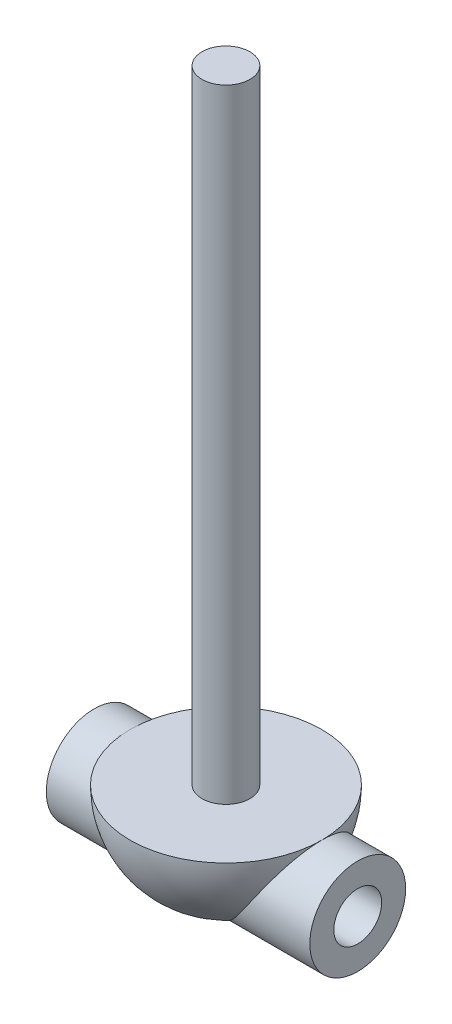
ISO-10303-21;
HEADER;
FILE_DESCRIPTION(('STEP AP214'),'2;1');
FILE_NAME('part.step','',(''),(''),'','','');
FILE_SCHEMA(('AUTOMOTIVE_DESIGN { 1 0 10303 214 1 1 1 1 }'));
ENDSEC;
DATA;
#1=APPLICATION_CONTEXT('core data for automotive mechanical design processes');
#2=APPLICATION_PROTOCOL_DEFINITION('international standard','automotive_design',2000,#1);
#3=PRODUCT_CONTEXT('',#1,'mechanical');
#4=PRODUCT('Part','Part','',(#3));
#5=PRODUCT_RELATED_PRODUCT_CATEGORY('part','',(#4));
#6=PRODUCT_DEFINITION_FORMATION('','',#4);
#7=PRODUCT_DEFINITION_CONTEXT('part definition',#1,'design');
#8=PRODUCT_DEFINITION('design','',#6,#7);
#9=PRODUCT_DEFINITION_SHAPE('','',#8);
#10=(LENGTH_UNIT() NAMED_UNIT(*) SI_UNIT(.MILLI.,.METRE.));
#11=(NAMED_UNIT(*) PLANE_ANGLE_UNIT() SI_UNIT($,.RADIAN.));
#12=(NAMED_UNIT(*) SI_UNIT($,.STERADIAN.) SOLID_ANGLE_UNIT());
#13=UNCERTAINTY_MEASURE_WITH_UNIT(LENGTH_MEASURE(1.E-05),#10,'distance_accuracy_value','');
#14=(GEOMETRIC_REPRESENTATION_CONTEXT(3) GLOBAL_UNCERTAINTY_ASSIGNED_CONTEXT((#13)) GLOBAL_UNIT_ASSIGNED_CONTEXT((#10,
#11,#12)) REPRESENTATION_CONTEXT('',''));
#15=CARTESIAN_POINT('',(0.,0.,0.));
#16=DIRECTION('',(0.,0.,1.));
#17=DIRECTION('',(1.,0.,0.));
#18=AXIS2_PLACEMENT_3D('',#15,#16,#17);
#19=CARTESIAN_POINT('',(0.,0.,0.));
#20=DIRECTION('',(0.,0.,1.));
#21=DIRECTION('',(-1.,0.,0.));
#22=AXIS2_PLACEMENT_3D('',#19,#20,#21);
#23=SPHERICAL_SURFACE('',#22,20.);
#24=CARTESIAN_POINT('',(0.,-20.,0.));
#25=CARTESIAN_POINT('',(4.14831613541327E-07,-19.9999999999998,-0.00102883859797912));
#26=CARTESIAN_POINT('',(0.00172323426402062,-19.9999998412064,-0.00205767717692917));
#27=CARTESIAN_POINT('',(0.00513064306400289,-19.9999990476308,-0.00462918097390953));
#28=CARTESIAN_POINT('',(0.00636643381856822,-19.9999982147365,-0.00617184835853093));
#29=CARTESIAN_POINT('',(0.0112930382150983,-19.9999938658802,-0.0118096893898919));
#30=CARTESIAN_POINT('',(0.0156626842264328,-19.9999881907312,-0.0159048421317701));
#31=CARTESIAN_POINT('',(0.0761590890814044,-19.9998739473029,-0.0730235194752118));
#32=CARTESIAN_POINT('',(0.126898929620371,-19.9993461620011,-0.126047065050154));
#33=CARTESIAN_POINT('',(0.230252165779001,-19.9974652291537,-0.231073636150307));
#34=CARTESIAN_POINT('',(0.282811694101503,-19.996127943494,-0.283076922430578));
#35=CARTESIAN_POINT('',(0.438698539962355,-19.9909328976958,-0.438033067555782));
#36=CARTESIAN_POINT('',(0.541279635916295,-19.9858894413477,-0.540952565935052));
#37=CARTESIAN_POINT('',(0.745681742284529,-19.972703981077,-0.745340640505116));
#38=CARTESIAN_POINT('',(0.847496485745131,-19.9646010281458,-0.846811433070955));
#39=CARTESIAN_POINT('',(1.05148686631379,-19.945245555244,-1.05003049918738));
#40=CARTESIAN_POINT('',(1.15366156769133,-19.9339766193805,-1.15177740586295));
#41=CARTESIAN_POINT('',(1.36433843111238,-19.9075161957602,-1.36122938944828));
#42=CARTESIAN_POINT('',(1.47283984106687,-19.8921247101919,-1.4689124480024));
#43=CARTESIAN_POINT('',(1.68960340953795,-19.8578491067159,-1.68363164382968));
#44=CARTESIAN_POINT('',(1.79786568815271,-19.8389700225273,-1.79066848674435));
#45=CARTESIAN_POINT('',(2.12382771400155,-19.7768373741828,-2.11217588727407));
#46=CARTESIAN_POINT('',(2.34141563507168,-19.7282500191868,-2.3257617832242));
#47=CARTESIAN_POINT('',(2.74310260592925,-19.6254689815266,-2.71751747005978));
#48=CARTESIAN_POINT('',(2.92726997472451,-19.5732467999649,-2.8961404849352));
#49=CARTESIAN_POINT('',(3.29494880556522,-19.4588530380295,-3.25033621520936));
#50=CARTESIAN_POINT('',(3.47846081897585,-19.3966950833429,-3.42591274810426));
#51=CARTESIAN_POINT('',(3.84260956001678,-19.263353274503,-3.77148965130733));
#52=CARTESIAN_POINT('',(4.0232525542533,-19.1922978124485,-3.94153289113636));
#53=CARTESIAN_POINT('',(4.38404486639263,-19.0406359407747,-4.27796385773468));
#54=CARTESIAN_POINT('',(4.56419397658952,-18.9600260022541,-4.4443502067829));
#55=CARTESIAN_POINT('',(5.12468636508459,-18.6941196099947,-4.95638246947543));
#56=CARTESIAN_POINT('',(5.50402128749026,-18.4924104741254,-5.29480069822149));
#57=CARTESIAN_POINT('',(6.26048195291774,-18.0475011756731,-5.94936780386797));
#58=CARTESIAN_POINT('',(6.63759383469815,-17.8041463480572,-6.26542722529558));
#59=CARTESIAN_POINT('',(7.40211566169654,-17.2680229454137,-6.88105358766624));
#60=CARTESIAN_POINT('',(7.78934722257092,-16.9736872481882,-7.17948282927069));
#61=CARTESIAN_POINT('',(8.557500662027,-16.3458268620981,-7.73998579661725));
#62=CARTESIAN_POINT('',(8.93842871655474,-16.0123434847459,-8.00209722172861));
#63=CARTESIAN_POINT('',(9.66551168278303,-15.3350105667996,-8.4672236002892));
#64=CARTESIAN_POINT('',(10.0121703096655,-14.9937083336209,-8.67316052656643));
#65=CARTESIAN_POINT('',(10.698396654239,-14.2831020671018,-9.04521380020614));
#66=CARTESIAN_POINT('',(11.0379625478574,-13.9137909409623,-9.21132001646749));
#67=CARTESIAN_POINT('',(11.7050677847445,-13.1550736517584,-9.49780000008189));
#68=CARTESIAN_POINT('',(12.0326968071013,-12.7659240362104,-9.61864295405974));
#69=CARTESIAN_POINT('',(12.6782420401307,-11.9683134980974,-9.81295489726059));
#70=CARTESIAN_POINT('',(12.9961620289596,-11.5598602490969,-9.88644254391011));
#71=CARTESIAN_POINT('',(13.5396958843185,-10.8365088823579,-9.96976923166016));
#72=CARTESIAN_POINT('',(13.7678645247057,-10.5248220191166,-9.99117284532529));
#73=CARTESIAN_POINT('',(14.21731629355,-9.89591934545801,-10.0044010829142));
#74=CARTESIAN_POINT('',(14.4386006347581,-9.57870452439355,-9.99623094670561));
#75=CARTESIAN_POINT('',(14.873907289693,-8.94071745974626,-9.94889099093629));
#76=CARTESIAN_POINT('',(15.0879153687065,-8.61993970803877,-9.90966368661991));
#77=CARTESIAN_POINT('',(15.5073583817711,-7.97829089533959,-9.79891223788607));
#78=CARTESIAN_POINT('',(15.7127930106541,-7.65741983143515,-9.72738694490586));
#79=CARTESIAN_POINT('',(16.1154237956081,-7.01669558604578,-9.55044898452555));
#80=CARTESIAN_POINT('',(16.3125564344658,-6.69686319313917,-9.44481519098688));
#81=CARTESIAN_POINT('',(16.6959957078322,-6.06402394431193,-9.19909118540763));
#82=CARTESIAN_POINT('',(16.8823038560355,-5.75101613788554,-9.05900580547618));
#83=CARTESIAN_POINT('',(17.2427727987653,-5.13596244506607,-8.74416359576804));
#84=CARTESIAN_POINT('',(17.4169431249849,-4.8339080485758,-8.56943439565502));
#85=CARTESIAN_POINT('',(17.751979575717,-4.24476385376487,-8.18540349096924));
#86=CARTESIAN_POINT('',(17.9128483837187,-3.95767104139061,-7.97610878541074));
#87=CARTESIAN_POINT('',(18.1992072651267,-3.44032550196901,-7.55424298432744));
#88=CARTESIAN_POINT('',(18.3265432510105,-3.20762747398298,-7.34591655451177));
#89=CARTESIAN_POINT('',(18.5693085923796,-2.75977544584315,-6.90491567392721));
#90=CARTESIAN_POINT('',(18.6847403384434,-2.54461792507544,-6.67224613065913));
#91=CARTESIAN_POINT('',(18.9026971200884,-2.1349957074141,-6.18410489135198));
#92=CARTESIAN_POINT('',(19.005232116636,-1.94051505866682,-5.92865105695341));
#93=CARTESIAN_POINT('',(19.196574043518,-1.57503509462071,-5.39667071627836));
#94=CARTESIAN_POINT('',(19.2853832250899,-1.40403192918063,-5.12014767679603));
#95=CARTESIAN_POINT('',(19.4368267389484,-1.11073281469695,-4.58905855133343));
#96=CARTESIAN_POINT('',(19.5013871404702,-0.984968550420588,-4.33694973472204));
#97=CARTESIAN_POINT('',(19.6192659232045,-0.754394047225822,-3.820814767167));
#98=CARTESIAN_POINT('',(19.6725858880424,-0.649580856692405,-3.55679030134915));
#99=CARTESIAN_POINT('',(19.7675213823416,-0.462367605790171,-3.01903733735542));
#100=CARTESIAN_POINT('',(19.8091434370243,-0.379955050950195,-2.74531434546647));
#101=CARTESIAN_POINT('',(19.8803600087888,-0.238627855087312,-2.19033874532173));
#102=CARTESIAN_POINT('',(19.9099553388692,-0.17971162573321,-1.90908664739903));
#103=CARTESIAN_POINT('',(19.9546125785941,-0.0906941389667483,-1.36869640638369));
#104=CARTESIAN_POINT('',(19.9707928906749,-0.0583776357683751,-1.11001281455245));
#105=CARTESIAN_POINT('',(19.9929788385115,-0.0140460943366076,-0.590488290879405));
#106=CARTESIAN_POINT('',(19.9989852580754,-0.00202949217624818,-0.329647526784566));
#107=CARTESIAN_POINT('',(20.0007784039475,0.00155681761374513,0.192145669602204));
#108=CARTESIAN_POINT('',(19.9965675355559,-0.00686866238878316,0.453098061155324));
#109=CARTESIAN_POINT('',(19.97796341209,-0.0440532256627959,0.973184689005887));
#110=CARTESIAN_POINT('',(19.9635701954145,-0.0728122322542305,1.23231893215605));
#111=CARTESIAN_POINT('',(19.9253800246893,-0.148979040969017,1.73795698640303));
#112=CARTESIAN_POINT('',(19.9019234391477,-0.195711594742749,1.98458871143244));
#113=CARTESIAN_POINT('',(19.8457823893017,-0.307285439683508,2.47263860614405));
#114=CARTESIAN_POINT('',(19.8130982327125,-0.372126126991155,2.71405694938988));
#115=CARTESIAN_POINT('',(19.7387214767697,-0.519212814724229,3.19010027747987));
#116=CARTESIAN_POINT('',(19.6970288751781,-0.601458819473932,3.42472526063622));
#117=CARTESIAN_POINT('',(19.604904083296,-0.782492823763271,3.88572914240185));
#118=CARTESIAN_POINT('',(19.5544716627317,-0.881281259155388,4.1121078235499));
#119=CARTESIAN_POINT('',(19.4438513721776,-1.09698879535432,4.56068211506981));
#120=CARTESIAN_POINT('',(19.3834565137957,-1.21428961000836,4.78264300314599));
#121=CARTESIAN_POINT('',(19.2541933438638,-1.46401072696621,5.21529282301572));
#122=CARTESIAN_POINT('',(19.185324962152,-1.59643115446135,5.42598166145477));
#123=CARTESIAN_POINT('',(19.0395003265513,-1.87513713673495,5.83505493596763));
#124=CARTESIAN_POINT('',(18.9625431129618,-2.02142433653605,6.03343790755993));
#125=CARTESIAN_POINT('',(18.8009525696274,-2.32653550945153,6.41700943457038));
#126=CARTESIAN_POINT('',(18.7163184969837,-2.48536069568845,6.60219670992244));
#127=CARTESIAN_POINT('',(18.5333290095976,-2.82623435862028,6.97171483701254));
#128=CARTESIAN_POINT('',(18.4344226457843,-3.00913175580195,7.15498995212919));
#129=CARTESIAN_POINT('',(18.2287711201836,-3.38612381622127,7.50485073767034));
#130=CARTESIAN_POINT('',(18.1220256381662,-3.58021893681909,7.6714357256412));
#131=CARTESIAN_POINT('',(17.9011780112694,-3.97800103396177,7.98749494374025));
#132=CARTESIAN_POINT('',(17.787073990102,-4.18169045327297,8.13696478264886));
#133=CARTESIAN_POINT('',(17.5520223025774,-4.59701637726014,8.41847479493727));
#134=CARTESIAN_POINT('',(17.431074005478,-4.80865361376985,8.55051335816849));
#135=CARTESIAN_POINT('',(17.1691306283392,-5.2619970219893,8.81061460419411));
#136=CARTESIAN_POINT('',(17.0273950067467,-5.50444712836793,8.93663659964228));
#137=CARTESIAN_POINT('',(16.7366974619657,-5.99520436578143,9.16706675853604));
#138=CARTESIAN_POINT('',(16.5877350779776,-6.24351186978122,9.27147354149031));
#139=CARTESIAN_POINT('',(16.2831479815078,-6.7441143024559,9.45889253342769));
#140=CARTESIAN_POINT('',(16.1275224044337,-6.99640974589612,9.54190195609419));
#141=CARTESIAN_POINT('',(15.8101595948264,-7.50320196704659,9.68687150178481));
#142=CARTESIAN_POINT('',(15.6484217542897,-7.75769896179923,9.74882952461249));
#143=CARTESIAN_POINT('',(15.297405319394,-8.30120767505458,9.8590510526541));
#144=CARTESIAN_POINT('',(15.1073289022756,-8.59029923735044,9.90438920515326));
#145=CARTESIAN_POINT('',(14.720652853984,-9.16698837140469,9.96946902954632));
#146=CARTESIAN_POINT('',(14.5240527152856,-9.45458582490355,9.98920870514755));
#147=CARTESIAN_POINT('',(14.1247484051175,-10.0265690350494,10.004060157075));
#148=CARTESIAN_POINT('',(13.9220382760579,-10.3109512591101,9.99914706904551));
#149=CARTESIAN_POINT('',(13.5112535716389,-10.8744112009495,9.96569492486226));
#150=CARTESIAN_POINT('',(13.3031784562485,-11.1534883797802,9.93715348124994));
#151=CARTESIAN_POINT('',(12.8518368644128,-11.744413871287,9.85182751879243));
#152=CARTESIAN_POINT('',(12.6078197890246,-12.0551898353314,9.79156596301241));
#153=CARTESIAN_POINT('',(12.1141327748394,-12.6654367004932,9.64334296687269));
#154=CARTESIAN_POINT('',(11.8644623360037,-12.9649065952935,9.55537906729532));
#155=CARTESIAN_POINT('',(11.3607954623674,-13.5497784222024,9.35384830643039));
#156=CARTESIAN_POINT('',(11.1068128055058,-13.835216761902,9.2403524879252));
#157=CARTESIAN_POINT('',(10.5944040100122,-14.3912129563096,8.98945426076028));
#158=CARTESIAN_POINT('',(10.3359775302708,-14.6617696619446,8.85205000943174));
#159=CARTESIAN_POINT('',(9.78104862184817,-15.2208908188116,8.53572094219382));
#160=CARTESIAN_POINT('',(9.48399470238206,-15.507168403391,8.35371462881153));
#161=CARTESIAN_POINT('',(8.88548749705673,-16.0568846901373,7.96414908131655));
#162=CARTESIAN_POINT('',(8.58403349032049,-16.3203195997313,7.75658561773783));
#163=CARTESIAN_POINT('',(7.97319848041232,-16.8261325632142,7.31560122227494));
#164=CARTESIAN_POINT('',(7.66376545685834,-17.0681727309438,7.08186502695808));
#165=CARTESIAN_POINT('',(7.04169307282176,-17.5255645048355,6.59376415392885));
#166=CARTESIAN_POINT('',(6.72905461925026,-17.7409234459484,6.33940517759105));
#167=CARTESIAN_POINT('',(6.05761187393965,-18.1716523973079,5.77637047203211));
#168=CARTESIAN_POINT('',(5.69839241476785,-18.3829199271397,5.46504376871659));
#169=CARTESIAN_POINT('',(4.97654529951651,-18.7682226997751,4.82273086402325));
#170=CARTESIAN_POINT('',(4.61391352193555,-18.9422045485955,4.49171732521746));
#171=CARTESIAN_POINT('',(3.90511072542334,-19.2434597739524,3.83186223284448));
#172=CARTESIAN_POINT('',(3.55905134533433,-19.3726738463678,3.50378304829977));
#173=CARTESIAN_POINT('',(2.86718547090612,-19.5949132520109,2.83898001881138));
#174=CARTESIAN_POINT('',(2.52138692359514,-19.6881222761138,2.50230965282746));
#175=CARTESIAN_POINT('',(2.01080995881068,-19.7991835558276,2.00083856443555));
#176=CARTESIAN_POINT('',(1.84636520956727,-19.8309001374552,1.83865942020089));
#177=CARTESIAN_POINT('',(1.59843352810732,-19.8725983779515,1.59336295187363));
#178=CARTESIAN_POINT('',(1.51500789717401,-19.8855860389892,1.51069098012651));
#179=CARTESIAN_POINT('',(1.347999039417,-19.9094937429417,1.34497294286252));
#180=CARTESIAN_POINT('',(1.26441575164349,-19.9204109783494,1.26192652352417));
#181=CARTESIAN_POINT('',(1.08127582055366,-19.9420388619524,1.07972721655002));
#182=CARTESIAN_POINT('',(0.981718610240644,-19.9523114671108,0.98052872768434));
#183=CARTESIAN_POINT('',(0.782953698604524,-19.969836849711,0.782425246832267));
#184=CARTESIAN_POINT('',(0.683746918455959,-19.9771052484138,0.683521461099217));
#185=CARTESIAN_POINT('',(0.491735960534729,-19.9883510932146,0.491462805853133));
#186=CARTESIAN_POINT('',(0.398902647846471,-19.9924988892102,0.398316691874606));
#187=CARTESIAN_POINT('',(0.257838417294251,-19.9967800201044,0.258080858752206));
#188=CARTESIAN_POINT('',(0.210275495307926,-19.9978842001169,0.211016056901819));
#189=CARTESIAN_POINT('',(0.116733621107412,-19.99944268341,0.115967636790702));
#190=CARTESIAN_POINT('',(0.0708029825578258,-19.9998840274415,0.0679838234575748));
#191=CARTESIAN_POINT('',(0.0156668270458145,-19.9999881858514,0.0159072729241776));
#192=CARTESIAN_POINT('',(0.011298202683801,-19.9999938591253,0.0118145507396099));
#193=CARTESIAN_POINT('',(0.00637232755286715,-19.9999982114663,0.00617753731017496));
#194=CARTESIAN_POINT('',(0.00513566190497414,-19.9999990459854,0.00463326626110509));
#195=CARTESIAN_POINT('',(0.00172434489336341,-19.9999998409519,0.00205933151752605));
#196=CARTESIAN_POINT('',(-4.15165103230015E-07,-20.0000000000002,0.00102966574923318));
#197=CARTESIAN_POINT('',(0.,-20.,0.));
#198=B_SPLINE_CURVE_WITH_KNOTS('',3,(#24,#25,#26,#27,#28,#29,#30,#31,#32,#33,#34,#35,#36,#37,
#38,#39,#40,#41,#42,#43,#44,#45,#46,#47,#48,#49,#50,#51,#52,#53,#54,#55,#56,#57,#58,#59,#60,#61,
#62,#63,#64,#65,#66,#67,#68,#69,#70,#71,#72,#73,#74,#75,#76,#77,#78,#79,#80,#81,#82,#83,#84,#85,
#86,#87,#88,#89,#90,#91,#92,#93,#94,#95,#96,#97,#98,#99,#100,#101,#102,#103,#104,#105,#106,#107,
#108,#109,#110,#111,#112,#113,#114,#115,#116,#117,#118,#119,#120,#121,#122,#123,#124,#125,#126,
#127,#128,#129,#130,#131,#132,#133,#134,#135,#136,#137,#138,#139,#140,#141,#142,#143,#144,#145,
#146,#147,#148,#149,#150,#151,#152,#153,#154,#155,#156,#157,#158,#159,#160,#161,#162,#163,#164,
#165,#166,#167,#168,#169,#170,#171,#172,#173,#174,#175,#176,#177,#178,#179,#180,#181,#182,#183,
#184,#185,#186,#187,#188,#189,#190,#191,#192,#193,#194,#195,#196,#197),.UNSPECIFIED.,.T.,.F.,(4,
2,2,2,2,2,2,2,2,2,2,2,2,2,2,2,2,2,2,2,2,2,2,2,2,2,2,2,2,2,2,2,2,2,2,2,2,2,2,2,2,2,2,2,2,2,2,2,2,
2,2,2,2,2,2,2,2,2,2,2,2,2,2,2,2,2,2,2,2,2,2,2,2,2,2,2,2,2,2,2,2,2,2,2,2,2,4),(0.,
0.00436499259836137,0.0109099486876245,0.0282842800916863,0.253244938755042,0.473934146190299,
0.910985263341534,1.34263680751294,1.77656917316124,2.23742552093615,2.69762183024654,
3.6234796590737,4.40875359345669,5.19295971758475,5.96693059261125,6.74118822621966,
8.37973689844898,10.0245084393388,11.7339749663682,13.4416534863354,15.0242831975971,
16.6073150311003,18.1734509465808,19.7389694453102,20.8984545416123,22.0577342107707,
23.2191646602754,24.3806364151642,25.5497945134811,26.7187887214998,27.8868543388107,
29.0546837290814,30.0650915587197,31.0752960841436,32.0847155106338,33.0939692012383,
33.9599205316288,34.825749779533,35.6910950955441,36.5563819050441,37.3389970284071,
38.1215518554799,38.903922475473,39.6862901450728,40.4417558394964,41.1971963441022,
41.9526370363942,42.7080976358284,43.4818860266487,44.2556808249503,45.0295675341003,
45.8035292132471,46.6341661516373,47.4648370406407,48.295720578892,49.1266808132659,
50.0491893419338,50.9717567699723,51.8944442720678,52.8172237992266,53.8629777107442,
54.9088131702918,55.9557036534822,57.0026999295915,58.2005614360984,59.3985293102465,
60.5932041774835,61.7879711614231,63.139317171396,64.4908871176546,65.8609718101122,
67.2306790120899,68.78946831074,70.3504751335925,71.8312714686478,73.304410011402,
74.003677681343,74.3581601150988,74.7131198445871,75.135902278656,75.5564578009278,
75.9519434200104,76.1516661753194,76.3552451176214,76.3726091349962,76.3791608958099,
76.3835293977139),.UNSPECIFIED.);
#199=CARTESIAN_POINT('',(0.,-20.,0.));
#200=VERTEX_POINT('',#199);
#201=CARTESIAN_POINT('',(20.,0.,0.));
#202=VERTEX_POINT('',#201);
#203=EDGE_CURVE('E74',#200,#202,#198,.T.);
#204=ORIENTED_EDGE('',*,*,#203,.F.);
#205=CARTESIAN_POINT('',(0.,-20.,0.));
#206=CARTESIAN_POINT('',(-4.14831592724645E-07,-19.9999999999998,0.00102883859797912));
#207=CARTESIAN_POINT('',(-0.0017232342639998,-19.9999998412064,0.00205767717692917));
#208=CARTESIAN_POINT('',(-0.00513064306398208,-19.9999990476308,0.00462918097390953));
#209=CARTESIAN_POINT('',(-0.0063664338185474,-19.9999982147365,0.00617184835853093));
#210=CARTESIAN_POINT('',(-0.0112930382150774,-19.9999938658802,0.0118096893898919));
#211=CARTESIAN_POINT('',(-0.015662684226412,-19.9999881907312,0.0159048421317701));
#212=CARTESIAN_POINT('',(-0.0761590890813836,-19.9998739473029,0.0730235194752118));
#213=CARTESIAN_POINT('',(-0.12689892962035,-19.9993461620011,0.126047065050154));
#214=CARTESIAN_POINT('',(-0.23025216577898,-19.9974652291537,0.231073636150307));
#215=CARTESIAN_POINT('',(-0.282811694101482,-19.996127943494,0.283076922430578));
#216=CARTESIAN_POINT('',(-0.438698539962334,-19.9909328976958,0.438033067555782));
#217=CARTESIAN_POINT('',(-0.541279635916274,-19.9858894413477,0.540952565935052));
#218=CARTESIAN_POINT('',(-0.745681742284508,-19.972703981077,0.745340640505116));
#219=CARTESIAN_POINT('',(-0.84749648574511,-19.9646010281458,0.846811433070955));
#220=CARTESIAN_POINT('',(-1.05148686631376,-19.945245555244,1.05003049918738));
#221=CARTESIAN_POINT('',(-1.15366156769131,-19.9339766193805,1.15177740586295));
#222=CARTESIAN_POINT('',(-1.36433843111236,-19.9075161957602,1.36122938944828));
#223=CARTESIAN_POINT('',(-1.47283984106685,-19.8921247101919,1.4689124480024));
#224=CARTESIAN_POINT('',(-1.68960340953793,-19.8578491067159,1.68363164382968));
#225=CARTESIAN_POINT('',(-1.79786568815269,-19.8389700225273,1.79066848674435));
#226=CARTESIAN_POINT('',(-2.12382771400152,-19.7768373741828,2.11217588727407));
#227=CARTESIAN_POINT('',(-2.34141563507166,-19.7282500191868,2.3257617832242));
#228=CARTESIAN_POINT('',(-2.74310260592923,-19.6254689815266,2.71751747005978));
#229=CARTESIAN_POINT('',(-2.92726997472449,-19.5732467999649,2.8961404849352));
#230=CARTESIAN_POINT('',(-3.2949488055652,-19.4588530380295,3.25033621520936));
#231=CARTESIAN_POINT('',(-3.47846081897583,-19.3966950833429,3.42591274810426));
#232=CARTESIAN_POINT('',(-3.84260956001676,-19.263353274503,3.77148965130733));
#233=CARTESIAN_POINT('',(-4.02325255425328,-19.1922978124485,3.94153289113636));
#234=CARTESIAN_POINT('',(-4.38404486639261,-19.0406359407747,4.27796385773468));
#235=CARTESIAN_POINT('',(-4.5641939765895,-18.9600260022541,4.4443502067829));
#236=CARTESIAN_POINT('',(-5.12468636508457,-18.6941196099947,4.95638246947543));
#237=CARTESIAN_POINT('',(-5.50402128749024,-18.4924104741254,5.29480069822149));
#238=CARTESIAN_POINT('',(-6.26048195291772,-18.0475011756731,5.94936780386797));
#239=CARTESIAN_POINT('',(-6.63759383469813,-17.8041463480572,6.26542722529558));
#240=CARTESIAN_POINT('',(-7.40211566169651,-17.2680229454137,6.88105358766624));
#241=CARTESIAN_POINT('',(-7.78934722257091,-16.9736872481882,7.17948282927069));
#242=CARTESIAN_POINT('',(-8.55750066202699,-16.3458268620981,7.73998579661725));
#243=CARTESIAN_POINT('',(-8.93842871655472,-16.0123434847459,8.00209722172861));
#244=CARTESIAN_POINT('',(-9.66551168278301,-15.3350105667996,8.4672236002892));
#245=CARTESIAN_POINT('',(-10.0121703096655,-14.9937083336209,8.67316052656643));
#246=CARTESIAN_POINT('',(-10.698396654239,-14.2831020671018,9.04521380020614));
#247=CARTESIAN_POINT('',(-11.0379625478574,-13.9137909409623,9.21132001646749));
#248=CARTESIAN_POINT('',(-11.7050677847445,-13.1550736517584,9.49780000008189));
#249=CARTESIAN_POINT('',(-12.0326968071013,-12.7659240362104,9.61864295405974));
#250=CARTESIAN_POINT('',(-12.6782420401307,-11.9683134980974,9.81295489726059));
#251=CARTESIAN_POINT('',(-12.9961620289596,-11.5598602490969,9.88644254391011));
#252=CARTESIAN_POINT('',(-13.5396958843185,-10.8365088823579,9.96976923166016));
#253=CARTESIAN_POINT('',(-13.7678645247057,-10.5248220191166,9.99117284532529));
#254=CARTESIAN_POINT('',(-14.21731629355,-9.89591934545801,10.0044010829142));
#255=CARTESIAN_POINT('',(-14.4386006347581,-9.57870452439355,9.99623094670561));
#256=CARTESIAN_POINT('',(-14.8739072896929,-8.94071745974626,9.94889099093629));
#257=CARTESIAN_POINT('',(-15.0879153687065,-8.61993970803877,9.90966368661991));
#258=CARTESIAN_POINT('',(-15.5073583817711,-7.97829089533959,9.79891223788607));
#259=CARTESIAN_POINT('',(-15.7127930106541,-7.65741983143515,9.72738694490586));
#260=CARTESIAN_POINT('',(-16.1154237956081,-7.01669558604578,9.55044898452555));
#261=CARTESIAN_POINT('',(-16.3125564344657,-6.69686319313917,9.44481519098688));
#262=CARTESIAN_POINT('',(-16.6959957078322,-6.06402394431193,9.19909118540763));
#263=CARTESIAN_POINT('',(-16.8823038560355,-5.75101613788554,9.05900580547618));
#264=CARTESIAN_POINT('',(-17.2427727987653,-5.13596244506607,8.74416359576804));
#265=CARTESIAN_POINT('',(-17.4169431249849,-4.8339080485758,8.56943439565502));
#266=CARTESIAN_POINT('',(-17.751979575717,-4.24476385376487,8.18540349096924));
#267=CARTESIAN_POINT('',(-17.9128483837186,-3.95767104139061,7.97610878541074));
#268=CARTESIAN_POINT('',(-18.1992072651267,-3.44032550196901,7.55424298432744));
#269=CARTESIAN_POINT('',(-18.3265432510105,-3.20762747398298,7.34591655451177));
#270=CARTESIAN_POINT('',(-18.5693085923796,-2.75977544584315,6.90491567392721));
#271=CARTESIAN_POINT('',(-18.6847403384434,-2.54461792507544,6.67224613065913));
#272=CARTESIAN_POINT('',(-18.9026971200883,-2.1349957074141,6.18410489135198));
#273=CARTESIAN_POINT('',(-19.005232116636,-1.94051505866682,5.92865105695341));
#274=CARTESIAN_POINT('',(-19.1965740435179,-1.57503509462071,5.39667071627836));
#275=CARTESIAN_POINT('',(-19.2853832250899,-1.40403192918063,5.12014767679603));
#276=CARTESIAN_POINT('',(-19.4368267389484,-1.11073281469695,4.58905855133343));
#277=CARTESIAN_POINT('',(-19.5013871404702,-0.984968550420588,4.33694973472204));
#278=CARTESIAN_POINT('',(-19.6192659232045,-0.754394047225822,3.820814767167));
#279=CARTESIAN_POINT('',(-19.6725858880424,-0.649580856692405,3.55679030134915));
#280=CARTESIAN_POINT('',(-19.7675213823416,-0.462367605790171,3.01903733735542));
#281=CARTESIAN_POINT('',(-19.8091434370243,-0.379955050950195,2.74531434546647));
#282=CARTESIAN_POINT('',(-19.8803600087887,-0.238627855087312,2.19033874532173));
#283=CARTESIAN_POINT('',(-19.9099553388691,-0.17971162573321,1.90908664739903));
#284=CARTESIAN_POINT('',(-19.9546125785941,-0.0906941389667483,1.36869640638369));
#285=CARTESIAN_POINT('',(-19.9707928906749,-0.0583776357683751,1.11001281455245));
#286=CARTESIAN_POINT('',(-19.9929788385115,-0.0140460943366076,0.590488290879405));
#287=CARTESIAN_POINT('',(-19.9989852580754,-0.00202949217624818,0.329647526784566));
#288=CARTESIAN_POINT('',(-20.0007784039475,0.00155681761374513,-0.192145669602204));
#289=CARTESIAN_POINT('',(-19.9965675355559,-0.00686866238878316,-0.453098061155324));
#290=CARTESIAN_POINT('',(-19.97796341209,-0.0440532256627959,-0.973184689005887));
#291=CARTESIAN_POINT('',(-19.9635701954144,-0.0728122322542305,-1.23231893215605));
#292=CARTESIAN_POINT('',(-19.9253800246893,-0.148979040969017,-1.73795698640303));
#293=CARTESIAN_POINT('',(-19.9019234391477,-0.195711594742749,-1.98458871143244));
#294=CARTESIAN_POINT('',(-19.8457823893017,-0.307285439683508,-2.47263860614405));
#295=CARTESIAN_POINT('',(-19.8130982327125,-0.372126126991155,-2.71405694938988));
#296=CARTESIAN_POINT('',(-19.7387214767697,-0.519212814724229,-3.19010027747987));
#297=CARTESIAN_POINT('',(-19.697028875178,-0.601458819473932,-3.42472526063622));
#298=CARTESIAN_POINT('',(-19.604904083296,-0.782492823763271,-3.88572914240185));
#299=CARTESIAN_POINT('',(-19.5544716627317,-0.881281259155388,-4.1121078235499));
#300=CARTESIAN_POINT('',(-19.4438513721775,-1.09698879535432,-4.56068211506981));
#301=CARTESIAN_POINT('',(-19.3834565137957,-1.21428961000836,-4.78264300314599));
#302=CARTESIAN_POINT('',(-19.2541933438638,-1.46401072696621,-5.21529282301572));
#303=CARTESIAN_POINT('',(-19.185324962152,-1.59643115446135,-5.42598166145477));
#304=CARTESIAN_POINT('',(-19.0395003265513,-1.87513713673495,-5.83505493596763));
#305=CARTESIAN_POINT('',(-18.9625431129617,-2.02142433653605,-6.03343790755993));
#306=CARTESIAN_POINT('',(-18.8009525696273,-2.32653550945153,-6.41700943457038));
#307=CARTESIAN_POINT('',(-18.7163184969837,-2.48536069568845,-6.60219670992244));
#308=CARTESIAN_POINT('',(-18.5333290095975,-2.82623435862028,-6.97171483701254));
#309=CARTESIAN_POINT('',(-18.4344226457843,-3.00913175580195,-7.15498995212919));
#310=CARTESIAN_POINT('',(-18.2287711201836,-3.38612381622127,-7.50485073767034));
#311=CARTESIAN_POINT('',(-18.1220256381662,-3.58021893681909,-7.6714357256412));
#312=CARTESIAN_POINT('',(-17.9011780112694,-3.97800103396177,-7.98749494374025));
#313=CARTESIAN_POINT('',(-17.787073990102,-4.18169045327297,-8.13696478264886));
#314=CARTESIAN_POINT('',(-17.5520223025773,-4.59701637726014,-8.41847479493727));
#315=CARTESIAN_POINT('',(-17.431074005478,-4.80865361376985,-8.55051335816849));
#316=CARTESIAN_POINT('',(-17.1691306283391,-5.2619970219893,-8.81061460419411));
#317=CARTESIAN_POINT('',(-17.0273950067467,-5.50444712836793,-8.93663659964228));
#318=CARTESIAN_POINT('',(-16.7366974619657,-5.99520436578143,-9.16706675853604));
#319=CARTESIAN_POINT('',(-16.5877350779776,-6.24351186978122,-9.27147354149031));
#320=CARTESIAN_POINT('',(-16.2831479815078,-6.7441143024559,-9.45889253342769));
#321=CARTESIAN_POINT('',(-16.1275224044337,-6.99640974589612,-9.54190195609419));
#322=CARTESIAN_POINT('',(-15.8101595948263,-7.50320196704659,-9.68687150178481));
#323=CARTESIAN_POINT('',(-15.6484217542897,-7.75769896179923,-9.74882952461249));
#324=CARTESIAN_POINT('',(-15.297405319394,-8.30120767505458,-9.8590510526541));
#325=CARTESIAN_POINT('',(-15.1073289022756,-8.59029923735044,-9.90438920515326));
#326=CARTESIAN_POINT('',(-14.720652853984,-9.16698837140469,-9.96946902954632));
#327=CARTESIAN_POINT('',(-14.5240527152856,-9.45458582490355,-9.98920870514755));
#328=CARTESIAN_POINT('',(-14.1247484051175,-10.0265690350494,-10.004060157075));
#329=CARTESIAN_POINT('',(-13.9220382760579,-10.3109512591101,-9.99914706904551));
#330=CARTESIAN_POINT('',(-13.5112535716389,-10.8744112009495,-9.96569492486226));
#331=CARTESIAN_POINT('',(-13.3031784562485,-11.1534883797802,-9.93715348124994));
#332=CARTESIAN_POINT('',(-12.8518368644127,-11.744413871287,-9.85182751879243));
#333=CARTESIAN_POINT('',(-12.6078197890246,-12.0551898353314,-9.79156596301241));
#334=CARTESIAN_POINT('',(-12.1141327748394,-12.6654367004932,-9.64334296687269));
#335=CARTESIAN_POINT('',(-11.8644623360037,-12.9649065952935,-9.55537906729532));
#336=CARTESIAN_POINT('',(-11.3607954623674,-13.5497784222024,-9.35384830643039));
#337=CARTESIAN_POINT('',(-11.1068128055058,-13.835216761902,-9.2403524879252));
#338=CARTESIAN_POINT('',(-10.5944040100122,-14.3912129563096,-8.98945426076028));
#339=CARTESIAN_POINT('',(-10.3359775302707,-14.6617696619446,-8.85205000943174));
#340=CARTESIAN_POINT('',(-9.78104862184815,-15.2208908188116,-8.53572094219382));
#341=CARTESIAN_POINT('',(-9.48399470238204,-15.507168403391,-8.35371462881153));
#342=CARTESIAN_POINT('',(-8.88548749705672,-16.0568846901373,-7.96414908131655));
#343=CARTESIAN_POINT('',(-8.58403349032047,-16.3203195997313,-7.75658561773783));
#344=CARTESIAN_POINT('',(-7.9731984804123,-16.8261325632142,-7.31560122227494));
#345=CARTESIAN_POINT('',(-7.66376545685832,-17.0681727309438,-7.08186502695808));
#346=CARTESIAN_POINT('',(-7.04169307282174,-17.5255645048355,-6.59376415392885));
#347=CARTESIAN_POINT('',(-6.72905461925023,-17.7409234459484,-6.33940517759105));
#348=CARTESIAN_POINT('',(-6.05761187393963,-18.1716523973079,-5.77637047203211));
#349=CARTESIAN_POINT('',(-5.69839241476783,-18.3829199271397,-5.46504376871659));
#350=CARTESIAN_POINT('',(-4.97654529951649,-18.7682226997751,-4.82273086402325));
#351=CARTESIAN_POINT('',(-4.61391352193553,-18.9422045485955,-4.49171732521746));
#352=CARTESIAN_POINT('',(-3.90511072542332,-19.2434597739524,-3.83186223284448));
#353=CARTESIAN_POINT('',(-3.55905134533431,-19.3726738463678,-3.50378304829977));
#354=CARTESIAN_POINT('',(-2.8671854709061,-19.5949132520109,-2.83898001881138));
#355=CARTESIAN_POINT('',(-2.52138692359511,-19.6881222761138,-2.50230965282746));
#356=CARTESIAN_POINT('',(-2.01080995881066,-19.7991835558276,-2.00083856443555));
#357=CARTESIAN_POINT('',(-1.84636520956725,-19.8309001374552,-1.83865942020089));
#358=CARTESIAN_POINT('',(-1.5984335281073,-19.8725983779515,-1.59336295187363));
#359=CARTESIAN_POINT('',(-1.51500789717399,-19.8855860389892,-1.51069098012651));
#360=CARTESIAN_POINT('',(-1.34799903941698,-19.9094937429417,-1.34497294286252));
#361=CARTESIAN_POINT('',(-1.26441575164347,-19.9204109783494,-1.26192652352417));
#362=CARTESIAN_POINT('',(-1.08127582055364,-19.9420388619524,-1.07972721655002));
#363=CARTESIAN_POINT('',(-0.981718610240623,-19.9523114671108,-0.98052872768434));
#364=CARTESIAN_POINT('',(-0.782953698604504,-19.969836849711,-0.782425246832267));
#365=CARTESIAN_POINT('',(-0.683746918455938,-19.9771052484138,-0.683521461099217));
#366=CARTESIAN_POINT('',(-0.491735960534708,-19.9883510932146,-0.491462805853133));
#367=CARTESIAN_POINT('',(-0.39890264784645,-19.9924988892102,-0.398316691874606));
#368=CARTESIAN_POINT('',(-0.25783841729423,-19.9967800201044,-0.258080858752206));
#369=CARTESIAN_POINT('',(-0.210275495307905,-19.9978842001169,-0.211016056901819));
#370=CARTESIAN_POINT('',(-0.116733621107391,-19.99944268341,-0.115967636790702));
#371=CARTESIAN_POINT('',(-0.070802982557805,-19.9998840274415,-0.0679838234575748));
#372=CARTESIAN_POINT('',(-0.0156668270457936,-19.9999881858514,-0.0159072729241776));
#373=CARTESIAN_POINT('',(-0.0112982026837801,-19.9999938591253,-0.0118145507396099));
#374=CARTESIAN_POINT('',(-0.00637232755284634,-19.9999982114663,-0.00617753731017496));
#375=CARTESIAN_POINT('',(-0.00513566190495333,-19.9999990459854,-0.00463326626110509));
#376=CARTESIAN_POINT('',(-0.0017243448933426,-19.9999998409519,-0.00205933151752605));
#377=CARTESIAN_POINT('',(4.15165124046697E-07,-20.0000000000002,-0.00102966574923318));
#378=CARTESIAN_POINT('',(0.,-20.,0.));
#379=B_SPLINE_CURVE_WITH_KNOTS('',3,(#205,#206,#207,#208,#209,#210,#211,#212,#213,#214,#215,
#216,#217,#218,#219,#220,#221,#222,#223,#224,#225,#226,#227,#228,#229,#230,#231,#232,#233,#234,
#235,#236,#237,#238,#239,#240,#241,#242,#243,#244,#245,#246,#247,#248,#249,#250,#251,#252,#253,
#254,#255,#256,#257,#258,#259,#260,#261,#262,#263,#264,#265,#266,#267,#268,#269,#270,#271,#272,
#273,#274,#275,#276,#277,#278,#279,#280,#281,#282,#283,#284,#285,#286,#287,#288,#289,#290,#291,
#292,#293,#294,#295,#296,#297,#298,#299,#300,#301,#302,#303,#304,#305,#306,#307,#308,#309,#310,
#311,#312,#313,#314,#315,#316,#317,#318,#319,#320,#321,#322,#323,#324,#325,#326,#327,#328,#329,
#330,#331,#332,#333,#334,#335,#336,#337,#338,#339,#340,#341,#342,#343,#344,#345,#346,#347,#348,
#349,#350,#351,#352,#353,#354,#355,#356,#357,#358,#359,#360,#361,#362,#363,#364,#365,#366,#367,
#368,#369,#370,#371,#372,#373,#374,#375,#376,#377,#378),.UNSPECIFIED.,.T.,.F.,(4,2,2,2,2,2,2,2,
2,2,2,2,2,2,2,2,2,2,2,2,2,2,2,2,2,2,2,2,2,2,2,2,2,2,2,2,2,2,2,2,2,2,2,2,2,2,2,2,2,2,2,2,2,2,2,2,
2,2,2,2,2,2,2,2,2,2,2,2,2,2,2,2,2,2,2,2,2,2,2,2,2,2,2,2,2,2,4),(0.,0.00436499259836137,
0.0109099486876245,0.0282842800916863,0.253244938755042,0.473934146190299,0.910985263341534,
1.34263680751294,1.77656917316124,2.23742552093615,2.69762183024654,3.6234796590737,
4.40875359345669,5.19295971758475,5.96693059261125,6.74118822621966,8.37973689844898,
10.0245084393388,11.7339749663682,13.4416534863354,15.0242831975971,16.6073150311003,
18.1734509465808,19.7389694453102,20.8984545416123,22.0577342107707,23.2191646602754,
24.3806364151642,25.5497945134811,26.7187887214998,27.8868543388107,29.0546837290814,
30.0650915587197,31.0752960841436,32.0847155106338,33.0939692012383,33.9599205316288,
34.825749779533,35.6910950955441,36.5563819050441,37.3389970284071,38.1215518554799,
38.903922475473,39.6862901450728,40.4417558394964,41.1971963441022,41.9526370363942,
42.7080976358284,43.4818860266487,44.2556808249503,45.0295675341003,45.8035292132471,
46.6341661516373,47.4648370406407,48.295720578892,49.1266808132659,50.0491893419338,
50.9717567699723,51.8944442720678,52.8172237992266,53.8629777107442,54.9088131702918,
55.9557036534822,57.0026999295915,58.2005614360984,59.3985293102465,60.5932041774835,
61.7879711614231,63.139317171396,64.4908871176546,65.8609718101122,67.2306790120899,
68.78946831074,70.3504751335925,71.8312714686478,73.304410011402,74.003677681343,
74.3581601150988,74.7131198445871,75.135902278656,75.5564578009278,75.9519434200104,
76.1516661753194,76.3552451176214,76.3726091349962,76.3791608958099,76.3835293977139),.UNSPECIFIED.);
#380=CARTESIAN_POINT('',(-20.,0.,0.));
#381=VERTEX_POINT('',#380);
#382=EDGE_CURVE('E57',#381,#200,#379,.T.);
#383=ORIENTED_EDGE('',*,*,#382,.F.);
#384=CARTESIAN_POINT('',(0.,0.,0.));
#385=DIRECTION('',(0.,-1.,0.));
#386=DIRECTION('',(0.,0.,-1.));
#387=AXIS2_PLACEMENT_3D('',#384,#385,#386);
#388=CIRCLE('',#387,20.);
#389=EDGE_CURVE('E51',#381,#202,#388,.T.);
#390=ORIENTED_EDGE('',*,*,#389,.T.);
#391=EDGE_LOOP('',(#204,#383,#390));
#392=FACE_BOUND('',#391,.T.);
#393=ADVANCED_FACE('F41',(#392),#23,.T.);
#394=EDGE_CURVE('E68',#202,#200,#198,.T.);
#395=ORIENTED_EDGE('',*,*,#394,.F.);
#396=EDGE_CURVE('E11',#202,#381,#388,.T.);
#397=ORIENTED_EDGE('',*,*,#396,.T.);
#398=EDGE_CURVE('E70',#200,#381,#379,.T.);
#399=ORIENTED_EDGE('',*,*,#398,.F.);
#400=EDGE_LOOP('',(#395,#397,#399));
#401=FACE_BOUND('',#400,.T.);
#402=ADVANCED_FACE('F43',(#401),#23,.T.);
#403=CARTESIAN_POINT('',(0.,0.,0.));
#404=DIRECTION('',(0.,1.,0.));
#405=DIRECTION('',(0.,0.,-1.));
#406=AXIS2_PLACEMENT_3D('',#403,#404,#405);
#407=PLANE('',#406);
#408=CARTESIAN_POINT('',(0.,0.,0.));
#409=DIRECTION('',(0.,1.,0.));
#410=DIRECTION('',(-1.,0.,0.));
#411=AXIS2_PLACEMENT_3D('',#408,#409,#410);
#412=CIRCLE('',#411,5.);
#413=CARTESIAN_POINT('',(-5.,0.,0.));
#414=VERTEX_POINT('',#413);
#415=EDGE_CURVE('E187',#414,#414,#412,.T.);
#416=ORIENTED_EDGE('',*,*,#415,.F.);
#417=EDGE_LOOP('',(#416));
#418=FACE_BOUND('',#417,.T.);
#419=ORIENTED_EDGE('',*,*,#396,.F.);
#420=ORIENTED_EDGE('',*,*,#389,.F.);
#421=EDGE_LOOP('',(#419,#420));
#422=FACE_BOUND('',#421,.T.);
#423=ADVANCED_FACE('F77',(#418,#422),#407,.T.);
#424=CARTESIAN_POINT('',(-27.5,-10.,0.));
#425=DIRECTION('',(1.,0.,0.));
#426=DIRECTION('',(0.,0.,-1.));
#427=AXIS2_PLACEMENT_3D('',#424,#425,#426);
#428=PLANE('',#427);
#429=CARTESIAN_POINT('',(-27.5,-10.,0.));
#430=DIRECTION('',(1.,0.,0.));
#431=DIRECTION('',(0.,0.,-1.));
#432=AXIS2_PLACEMENT_3D('',#429,#430,#431);
#433=CIRCLE('',#432,5.);
#434=CARTESIAN_POINT('',(-27.5,-10.,-5.));
#435=VERTEX_POINT('',#434);
#436=EDGE_CURVE('E192',#435,#435,#433,.T.);
#437=ORIENTED_EDGE('',*,*,#436,.T.);
#438=EDGE_LOOP('',(#437));
#439=FACE_BOUND('',#438,.T.);
#440=CARTESIAN_POINT('',(-27.5,-10.,0.));
#441=DIRECTION('',(1.,0.,0.));
#442=DIRECTION('',(0.,0.,-1.));
#443=AXIS2_PLACEMENT_3D('',#440,#441,#442);
#444=CIRCLE('',#443,10.);
#445=CARTESIAN_POINT('',(-27.5,-10.,-10.));
#446=VERTEX_POINT('',#445);
#447=EDGE_CURVE('E203',#446,#446,#444,.T.);
#448=ORIENTED_EDGE('',*,*,#447,.F.);
#449=EDGE_LOOP('',(#448));
#450=FACE_BOUND('',#449,.T.);
#451=ADVANCED_FACE('F95',(#439,#450),#428,.F.);
#452=CARTESIAN_POINT('',(-27.5,-10.,0.));
#453=DIRECTION('',(1.,0.,0.));
#454=DIRECTION('',(0.,0.,-1.));
#455=AXIS2_PLACEMENT_3D('',#452,#453,#454);
#456=CYLINDRICAL_SURFACE('',#455,10.);
#457=ORIENTED_EDGE('',*,*,#382,.T.);
#458=ORIENTED_EDGE('',*,*,#398,.T.);
#459=EDGE_LOOP('',(#457,#458));
#460=FACE_BOUND('',#459,.T.);
#461=ORIENTED_EDGE('',*,*,#447,.T.);
#462=EDGE_LOOP('',(#461));
#463=FACE_BOUND('',#462,.T.);
#464=ADVANCED_FACE('F91',(#460,#463),#456,.T.);
#465=CARTESIAN_POINT('',(27.5,-10.,0.));
#466=DIRECTION('',(1.,0.,0.));
#467=DIRECTION('',(0.,0.,-1.));
#468=AXIS2_PLACEMENT_3D('',#465,#466,#467);
#469=CIRCLE('',#468,10.);
#470=CARTESIAN_POINT('',(27.5,-10.,-10.));
#471=VERTEX_POINT('',#470);
#472=EDGE_CURVE('E199',#471,#471,#469,.T.);
#473=ORIENTED_EDGE('',*,*,#472,.F.);
#474=EDGE_LOOP('',(#473));
#475=FACE_BOUND('',#474,.T.);
#476=ORIENTED_EDGE('',*,*,#394,.T.);
#477=ORIENTED_EDGE('',*,*,#203,.T.);
#478=EDGE_LOOP('',(#476,#477));
#479=FACE_BOUND('',#478,.T.);
#480=ADVANCED_FACE('F78',(#475,#479),#456,.T.);
#481=CARTESIAN_POINT('',(27.5,-10.,0.));
#482=DIRECTION('',(1.,0.,0.));
#483=DIRECTION('',(0.,0.,-1.));
#484=AXIS2_PLACEMENT_3D('',#481,#482,#483);
#485=PLANE('',#484);
#486=CARTESIAN_POINT('',(27.5,-10.,0.));
#487=DIRECTION('',(1.,0.,0.));
#488=DIRECTION('',(0.,0.,-1.));
#489=AXIS2_PLACEMENT_3D('',#486,#487,#488);
#490=CIRCLE('',#489,5.);
#491=CARTESIAN_POINT('',(27.5,-10.,-5.));
#492=VERTEX_POINT('',#491);
#493=EDGE_CURVE('E186',#492,#492,#490,.T.);
#494=ORIENTED_EDGE('',*,*,#493,.F.);
#495=EDGE_LOOP('',(#494));
#496=FACE_BOUND('',#495,.T.);
#497=ORIENTED_EDGE('',*,*,#472,.T.);
#498=EDGE_LOOP('',(#497));
#499=FACE_BOUND('',#498,.T.);
#500=ADVANCED_FACE('F123',(#496,#499),#485,.T.);
#501=CARTESIAN_POINT('',(-27.5,-10.,0.));
#502=DIRECTION('',(1.,0.,0.));
#503=DIRECTION('',(0.,0.,-1.));
#504=AXIS2_PLACEMENT_3D('',#501,#502,#503);
#505=CYLINDRICAL_SURFACE('',#504,5.);
#506=ORIENTED_EDGE('',*,*,#436,.F.);
#507=EDGE_LOOP('',(#506));
#508=FACE_BOUND('',#507,.T.);
#509=ORIENTED_EDGE('',*,*,#493,.T.);
#510=EDGE_LOOP('',(#509));
#511=FACE_BOUND('',#510,.T.);
#512=ADVANCED_FACE('F144',(#508,#511),#505,.F.);
#513=CARTESIAN_POINT('',(9.07785148099215E-13,130.,0.));
#514=DIRECTION('',(0.,-1.,0.));
#515=DIRECTION('',(1.,0.,0.));
#516=AXIS2_PLACEMENT_3D('',#513,#514,#515);
#517=CYLINDRICAL_SURFACE('',#516,5.);
#518=CARTESIAN_POINT('',(9.07785148099215E-13,130.,0.));
#519=DIRECTION('',(0.,1.,0.));
#520=DIRECTION('',(-1.,0.,0.));
#521=AXIS2_PLACEMENT_3D('',#518,#519,#520);
#522=CIRCLE('',#521,5.);
#523=CARTESIAN_POINT('',(-4.99999999999909,130.,0.));
#524=VERTEX_POINT('',#523);
#525=EDGE_CURVE('E184',#524,#524,#522,.T.);
#526=ORIENTED_EDGE('',*,*,#525,.F.);
#527=EDGE_LOOP('',(#526));
#528=FACE_BOUND('',#527,.T.);
#529=ORIENTED_EDGE('',*,*,#415,.T.);
#530=EDGE_LOOP('',(#529));
#531=FACE_BOUND('',#530,.T.);
#532=ADVANCED_FACE('F152',(#528,#531),#517,.T.);
#533=CARTESIAN_POINT('',(9.07785148099215E-13,130.,0.));
#534=DIRECTION('',(0.,1.,0.));
#535=DIRECTION('',(-1.,0.,0.));
#536=AXIS2_PLACEMENT_3D('',#533,#534,#535);
#537=PLANE('',#536);
#538=ORIENTED_EDGE('',*,*,#525,.T.);
#539=EDGE_LOOP('',(#538));
#540=FACE_BOUND('',#539,.T.);
#541=ADVANCED_FACE('F168',(#540),#537,.T.);
#542=CLOSED_SHELL('',(#393,#402,#423,#451,#464,#480,#500,#512,#532,#541));
#543=MANIFOLD_SOLID_BREP('B2',#542);
#544=ADVANCED_BREP_SHAPE_REPRESENTATION('',(#18,#543),#14);
#545=SHAPE_DEFINITION_REPRESENTATION(#9,#544);
ENDSEC;
END-ISO-10303-21;
